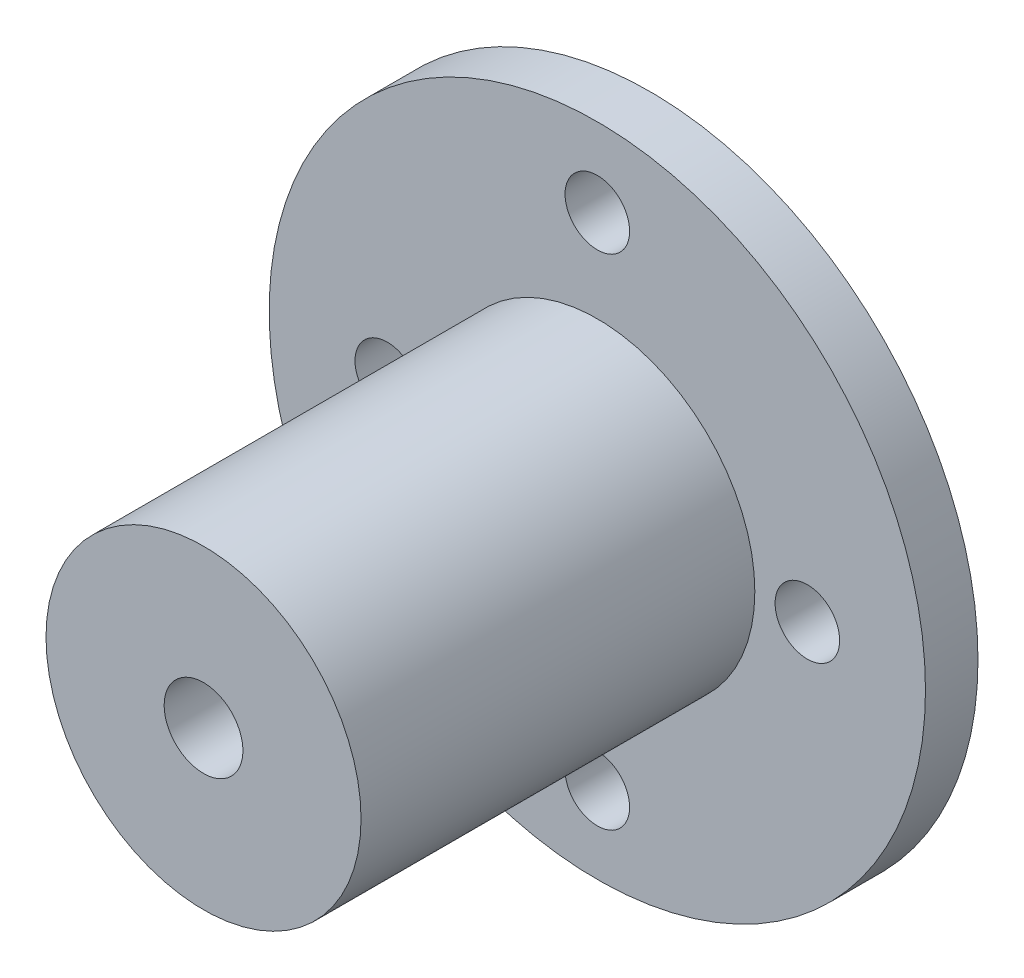
ISO-10303-21;
HEADER;
FILE_DESCRIPTION(('STEP AP214'),'2;1');
FILE_NAME('part.step','',(''),(''),'','','');
FILE_SCHEMA(('AUTOMOTIVE_DESIGN { 1 0 10303 214 1 1 1 1 }'));
ENDSEC;
DATA;
#1=APPLICATION_CONTEXT('core data for automotive mechanical design processes');
#2=APPLICATION_PROTOCOL_DEFINITION('international standard','automotive_design',2000,#1);
#3=PRODUCT_CONTEXT('',#1,'mechanical');
#4=PRODUCT('Part','Part','',(#3));
#5=PRODUCT_RELATED_PRODUCT_CATEGORY('part','',(#4));
#6=PRODUCT_DEFINITION_FORMATION('','',#4);
#7=PRODUCT_DEFINITION_CONTEXT('part definition',#1,'design');
#8=PRODUCT_DEFINITION('design','',#6,#7);
#9=PRODUCT_DEFINITION_SHAPE('','',#8);
#10=(LENGTH_UNIT() NAMED_UNIT(*) SI_UNIT(.MILLI.,.METRE.));
#11=(NAMED_UNIT(*) PLANE_ANGLE_UNIT() SI_UNIT($,.RADIAN.));
#12=(NAMED_UNIT(*) SI_UNIT($,.STERADIAN.) SOLID_ANGLE_UNIT());
#13=UNCERTAINTY_MEASURE_WITH_UNIT(LENGTH_MEASURE(1.E-05),#10,'distance_accuracy_value','');
#14=(GEOMETRIC_REPRESENTATION_CONTEXT(3) GLOBAL_UNCERTAINTY_ASSIGNED_CONTEXT((#13)) GLOBAL_UNIT_ASSIGNED_CONTEXT((#10,
#11,#12)) REPRESENTATION_CONTEXT('',''));
#15=CARTESIAN_POINT('',(0.,0.,0.));
#16=DIRECTION('',(0.,0.,1.));
#17=DIRECTION('',(1.,0.,0.));
#18=AXIS2_PLACEMENT_3D('',#15,#16,#17);
#19=CARTESIAN_POINT('',(171.170752313103,152.702756510375,2.));
#20=DIRECTION('',(0.,0.,1.));
#21=DIRECTION('',(1.,0.,0.));
#22=AXIS2_PLACEMENT_3D('',#19,#20,#21);
#23=PLANE('',#22);
#24=CARTESIAN_POINT('',(179.170752313103,152.702756510375,2.));
#25=DIRECTION('',(0.,0.,1.));
#26=DIRECTION('',(1.,0.,0.));
#27=AXIS2_PLACEMENT_3D('',#24,#25,#26);
#28=CIRCLE('',#27,1.22949999999999);
#29=CARTESIAN_POINT('',(180.400252313103,152.702756510375,2.));
#30=VERTEX_POINT('',#29);
#31=EDGE_CURVE('E75',#30,#30,#28,.T.);
#32=ORIENTED_EDGE('',*,*,#31,.F.);
#33=EDGE_LOOP('',(#32));
#34=FACE_BOUND('',#33,.T.);
#35=CARTESIAN_POINT('',(163.170752313103,152.702756510375,2.));
#36=DIRECTION('',(0.,0.,1.));
#37=DIRECTION('',(1.,0.,0.));
#38=AXIS2_PLACEMENT_3D('',#35,#36,#37);
#39=CIRCLE('',#38,1.22949999999999);
#40=CARTESIAN_POINT('',(164.400252313103,152.702756510375,2.));
#41=VERTEX_POINT('',#40);
#42=EDGE_CURVE('E69',#41,#41,#39,.T.);
#43=ORIENTED_EDGE('',*,*,#42,.F.);
#44=EDGE_LOOP('',(#43));
#45=FACE_BOUND('',#44,.T.);
#46=CARTESIAN_POINT('',(171.170752313103,162.202756510374,2.));
#47=DIRECTION('',(0.,0.,1.));
#48=DIRECTION('',(1.,0.,0.));
#49=AXIS2_PLACEMENT_3D('',#46,#47,#48);
#50=CIRCLE('',#49,1.22949999999999);
#51=CARTESIAN_POINT('',(172.400252313103,162.202756510374,2.));
#52=VERTEX_POINT('',#51);
#53=EDGE_CURVE('E63',#52,#52,#50,.T.);
#54=ORIENTED_EDGE('',*,*,#53,.F.);
#55=EDGE_LOOP('',(#54));
#56=FACE_BOUND('',#55,.T.);
#57=CARTESIAN_POINT('',(171.170752313103,143.202756510374,2.));
#58=DIRECTION('',(0.,0.,1.));
#59=DIRECTION('',(1.,0.,0.));
#60=AXIS2_PLACEMENT_3D('',#57,#58,#59);
#61=CIRCLE('',#60,1.22949999999999);
#62=CARTESIAN_POINT('',(172.400252313103,143.202756510374,2.));
#63=VERTEX_POINT('',#62);
#64=EDGE_CURVE('E57',#63,#63,#61,.T.);
#65=ORIENTED_EDGE('',*,*,#64,.F.);
#66=EDGE_LOOP('',(#65));
#67=FACE_BOUND('',#66,.T.);
#68=CARTESIAN_POINT('',(171.170752313103,152.702756510375,2.));
#69=DIRECTION('',(0.,0.,1.));
#70=DIRECTION('',(1.,0.,0.));
#71=AXIS2_PLACEMENT_3D('',#68,#69,#70);
#72=CIRCLE('',#71,12.5);
#73=CARTESIAN_POINT('',(183.670752313103,152.702756510375,2.));
#74=VERTEX_POINT('',#73);
#75=EDGE_CURVE('E38',#74,#74,#72,.T.);
#76=ORIENTED_EDGE('',*,*,#75,.T.);
#77=EDGE_LOOP('',(#76));
#78=FACE_BOUND('',#77,.T.);
#79=CARTESIAN_POINT('',(171.170752313103,152.702756510375,2.));
#80=DIRECTION('',(0.,0.,1.));
#81=DIRECTION('',(1.,0.,0.));
#82=AXIS2_PLACEMENT_3D('',#79,#80,#81);
#83=CIRCLE('',#82,6.00000000000001);
#84=CARTESIAN_POINT('',(177.170752313103,152.702756510375,2.));
#85=VERTEX_POINT('',#84);
#86=EDGE_CURVE('E46',#85,#85,#83,.T.);
#87=ORIENTED_EDGE('',*,*,#86,.F.);
#88=EDGE_LOOP('',(#87));
#89=FACE_BOUND('',#88,.T.);
#90=ADVANCED_FACE('F31',(#34,#45,#56,#67,#78,#89),#23,.T.);
#91=CARTESIAN_POINT('',(171.170752313103,152.702756510375,0.));
#92=DIRECTION('',(0.,0.,1.));
#93=DIRECTION('',(1.,0.,0.));
#94=AXIS2_PLACEMENT_3D('',#91,#92,#93);
#95=CYLINDRICAL_SURFACE('',#94,12.5);
#96=CARTESIAN_POINT('',(171.170752313103,152.702756510375,0.));
#97=DIRECTION('',(0.,0.,1.));
#98=DIRECTION('',(1.,0.,0.));
#99=AXIS2_PLACEMENT_3D('',#96,#97,#98);
#100=CIRCLE('',#99,12.5);
#101=CARTESIAN_POINT('',(183.670752313103,152.702756510375,0.));
#102=VERTEX_POINT('',#101);
#103=EDGE_CURVE('E10',#102,#102,#100,.T.);
#104=ORIENTED_EDGE('',*,*,#103,.T.);
#105=EDGE_LOOP('',(#104));
#106=FACE_BOUND('',#105,.T.);
#107=ORIENTED_EDGE('',*,*,#75,.F.);
#108=EDGE_LOOP('',(#107));
#109=FACE_BOUND('',#108,.T.);
#110=ADVANCED_FACE('F33',(#106,#109),#95,.T.);
#111=CARTESIAN_POINT('',(183.670752313103,152.702756510375,0.));
#112=DIRECTION('',(0.,0.,-1.));
#113=DIRECTION('',(-1.,0.,0.));
#114=AXIS2_PLACEMENT_3D('',#111,#112,#113);
#115=PLANE('',#114);
#116=CARTESIAN_POINT('',(179.170752313103,152.702756510375,0.));
#117=DIRECTION('',(0.,0.,-1.));
#118=DIRECTION('',(-1.,0.,0.));
#119=AXIS2_PLACEMENT_3D('',#116,#117,#118);
#120=CIRCLE('',#119,1.22949999999999);
#121=CARTESIAN_POINT('',(177.941252313103,152.702756510375,0.));
#122=VERTEX_POINT('',#121);
#123=EDGE_CURVE('E78',#122,#122,#120,.T.);
#124=ORIENTED_EDGE('',*,*,#123,.F.);
#125=EDGE_LOOP('',(#124));
#126=FACE_BOUND('',#125,.T.);
#127=CARTESIAN_POINT('',(163.170752313103,152.702756510375,0.));
#128=DIRECTION('',(0.,0.,-1.));
#129=DIRECTION('',(-1.,0.,0.));
#130=AXIS2_PLACEMENT_3D('',#127,#128,#129);
#131=CIRCLE('',#130,1.22949999999999);
#132=CARTESIAN_POINT('',(161.941252313103,152.702756510375,0.));
#133=VERTEX_POINT('',#132);
#134=EDGE_CURVE('E72',#133,#133,#131,.T.);
#135=ORIENTED_EDGE('',*,*,#134,.F.);
#136=EDGE_LOOP('',(#135));
#137=FACE_BOUND('',#136,.T.);
#138=CARTESIAN_POINT('',(171.170752313103,162.202756510374,0.));
#139=DIRECTION('',(0.,0.,-1.));
#140=DIRECTION('',(-1.,0.,0.));
#141=AXIS2_PLACEMENT_3D('',#138,#139,#140);
#142=CIRCLE('',#141,1.22949999999999);
#143=CARTESIAN_POINT('',(169.941252313103,162.202756510374,0.));
#144=VERTEX_POINT('',#143);
#145=EDGE_CURVE('E66',#144,#144,#142,.T.);
#146=ORIENTED_EDGE('',*,*,#145,.F.);
#147=EDGE_LOOP('',(#146));
#148=FACE_BOUND('',#147,.T.);
#149=CARTESIAN_POINT('',(171.170752313103,143.202756510374,0.));
#150=DIRECTION('',(0.,0.,-1.));
#151=DIRECTION('',(-1.,0.,0.));
#152=AXIS2_PLACEMENT_3D('',#149,#150,#151);
#153=CIRCLE('',#152,1.22949999999999);
#154=CARTESIAN_POINT('',(169.941252313103,143.202756510374,0.));
#155=VERTEX_POINT('',#154);
#156=EDGE_CURVE('E60',#155,#155,#153,.T.);
#157=ORIENTED_EDGE('',*,*,#156,.F.);
#158=EDGE_LOOP('',(#157));
#159=FACE_BOUND('',#158,.T.);
#160=CARTESIAN_POINT('',(171.170752313103,152.702756510375,0.));
#161=DIRECTION('',(0.,0.,-1.));
#162=DIRECTION('',(-1.,0.,0.));
#163=AXIS2_PLACEMENT_3D('',#160,#161,#162);
#164=CIRCLE('',#163,1.5);
#165=CARTESIAN_POINT('',(169.670752313103,152.702756510375,0.));
#166=VERTEX_POINT('',#165);
#167=EDGE_CURVE('E54',#166,#166,#164,.T.);
#168=ORIENTED_EDGE('',*,*,#167,.F.);
#169=EDGE_LOOP('',(#168));
#170=FACE_BOUND('',#169,.T.);
#171=ORIENTED_EDGE('',*,*,#103,.F.);
#172=EDGE_LOOP('',(#171));
#173=FACE_BOUND('',#172,.T.);
#174=ADVANCED_FACE('F84',(#126,#137,#148,#159,#170,#173),#115,.T.);
#175=CARTESIAN_POINT('',(171.170752313103,152.702756510375,17.));
#176=DIRECTION('',(0.,0.,-1.));
#177=DIRECTION('',(-1.,0.,0.));
#178=AXIS2_PLACEMENT_3D('',#175,#176,#177);
#179=CYLINDRICAL_SURFACE('',#178,6.00000000000001);
#180=CARTESIAN_POINT('',(171.170752313103,152.702756510375,17.));
#181=DIRECTION('',(0.,0.,1.));
#182=DIRECTION('',(1.,0.,0.));
#183=AXIS2_PLACEMENT_3D('',#180,#181,#182);
#184=CIRCLE('',#183,6.00000000000001);
#185=CARTESIAN_POINT('',(177.170752313103,152.702756510375,17.));
#186=VERTEX_POINT('',#185);
#187=EDGE_CURVE('E42',#186,#186,#184,.T.);
#188=ORIENTED_EDGE('',*,*,#187,.F.);
#189=EDGE_LOOP('',(#188));
#190=FACE_BOUND('',#189,.T.);
#191=ORIENTED_EDGE('',*,*,#86,.T.);
#192=EDGE_LOOP('',(#191));
#193=FACE_BOUND('',#192,.T.);
#194=ADVANCED_FACE('F87',(#190,#193),#179,.T.);
#195=CARTESIAN_POINT('',(171.170752313103,152.702756510375,17.));
#196=DIRECTION('',(0.,0.,1.));
#197=DIRECTION('',(1.,0.,0.));
#198=AXIS2_PLACEMENT_3D('',#195,#196,#197);
#199=PLANE('',#198);
#200=CARTESIAN_POINT('',(171.170752313103,152.702756510375,17.));
#201=DIRECTION('',(0.,0.,-1.));
#202=DIRECTION('',(-1.,0.,0.));
#203=AXIS2_PLACEMENT_3D('',#200,#201,#202);
#204=CIRCLE('',#203,1.5);
#205=CARTESIAN_POINT('',(169.670752313103,152.702756510375,17.));
#206=VERTEX_POINT('',#205);
#207=EDGE_CURVE('E50',#206,#206,#204,.T.);
#208=ORIENTED_EDGE('',*,*,#207,.T.);
#209=EDGE_LOOP('',(#208));
#210=FACE_BOUND('',#209,.T.);
#211=ORIENTED_EDGE('',*,*,#187,.T.);
#212=EDGE_LOOP('',(#211));
#213=FACE_BOUND('',#212,.T.);
#214=ADVANCED_FACE('F100',(#210,#213),#199,.T.);
#215=CARTESIAN_POINT('',(171.170752313103,152.702756510375,0.));
#216=DIRECTION('',(0.,0.,-1.));
#217=DIRECTION('',(-1.,0.,0.));
#218=AXIS2_PLACEMENT_3D('',#215,#216,#217);
#219=CYLINDRICAL_SURFACE('',#218,1.5);
#220=ORIENTED_EDGE('',*,*,#207,.F.);
#221=EDGE_LOOP('',(#220));
#222=FACE_BOUND('',#221,.T.);
#223=ORIENTED_EDGE('',*,*,#167,.T.);
#224=EDGE_LOOP('',(#223));
#225=FACE_BOUND('',#224,.T.);
#226=ADVANCED_FACE('F97',(#222,#225),#219,.F.);
#227=CARTESIAN_POINT('',(171.170752313103,143.202756510374,0.));
#228=DIRECTION('',(0.,0.,-1.));
#229=DIRECTION('',(-1.,0.,0.));
#230=AXIS2_PLACEMENT_3D('',#227,#228,#229);
#231=CYLINDRICAL_SURFACE('',#230,1.22949999999999);
#232=ORIENTED_EDGE('',*,*,#64,.T.);
#233=EDGE_LOOP('',(#232));
#234=FACE_BOUND('',#233,.T.);
#235=ORIENTED_EDGE('',*,*,#156,.T.);
#236=EDGE_LOOP('',(#235));
#237=FACE_BOUND('',#236,.T.);
#238=ADVANCED_FACE('F99',(#234,#237),#231,.F.);
#239=CARTESIAN_POINT('',(171.170752313103,162.202756510374,0.));
#240=DIRECTION('',(0.,0.,-1.));
#241=DIRECTION('',(-1.,0.,0.));
#242=AXIS2_PLACEMENT_3D('',#239,#240,#241);
#243=CYLINDRICAL_SURFACE('',#242,1.22949999999999);
#244=ORIENTED_EDGE('',*,*,#53,.T.);
#245=EDGE_LOOP('',(#244));
#246=FACE_BOUND('',#245,.T.);
#247=ORIENTED_EDGE('',*,*,#145,.T.);
#248=EDGE_LOOP('',(#247));
#249=FACE_BOUND('',#248,.T.);
#250=ADVANCED_FACE('F107',(#246,#249),#243,.F.);
#251=CARTESIAN_POINT('',(163.170752313103,152.702756510375,0.));
#252=DIRECTION('',(0.,0.,-1.));
#253=DIRECTION('',(-1.,0.,0.));
#254=AXIS2_PLACEMENT_3D('',#251,#252,#253);
#255=CYLINDRICAL_SURFACE('',#254,1.22949999999999);
#256=ORIENTED_EDGE('',*,*,#42,.T.);
#257=EDGE_LOOP('',(#256));
#258=FACE_BOUND('',#257,.T.);
#259=ORIENTED_EDGE('',*,*,#134,.T.);
#260=EDGE_LOOP('',(#259));
#261=FACE_BOUND('',#260,.T.);
#262=ADVANCED_FACE('F166',(#258,#261),#255,.F.);
#263=CARTESIAN_POINT('',(179.170752313103,152.702756510375,0.));
#264=DIRECTION('',(0.,0.,-1.));
#265=DIRECTION('',(-1.,0.,0.));
#266=AXIS2_PLACEMENT_3D('',#263,#264,#265);
#267=CYLINDRICAL_SURFACE('',#266,1.22949999999999);
#268=ORIENTED_EDGE('',*,*,#31,.T.);
#269=EDGE_LOOP('',(#268));
#270=FACE_BOUND('',#269,.T.);
#271=ORIENTED_EDGE('',*,*,#123,.T.);
#272=EDGE_LOOP('',(#271));
#273=FACE_BOUND('',#272,.T.);
#274=ADVANCED_FACE('F82',(#270,#273),#267,.F.);
#275=CLOSED_SHELL('',(#90,#110,#174,#194,#214,#226,#238,#250,#262,#274));
#276=MANIFOLD_SOLID_BREP('B2',#275);
#277=ADVANCED_BREP_SHAPE_REPRESENTATION('',(#18,#276),#14);
#278=SHAPE_DEFINITION_REPRESENTATION(#9,#277);
ENDSEC;
END-ISO-10303-21;
